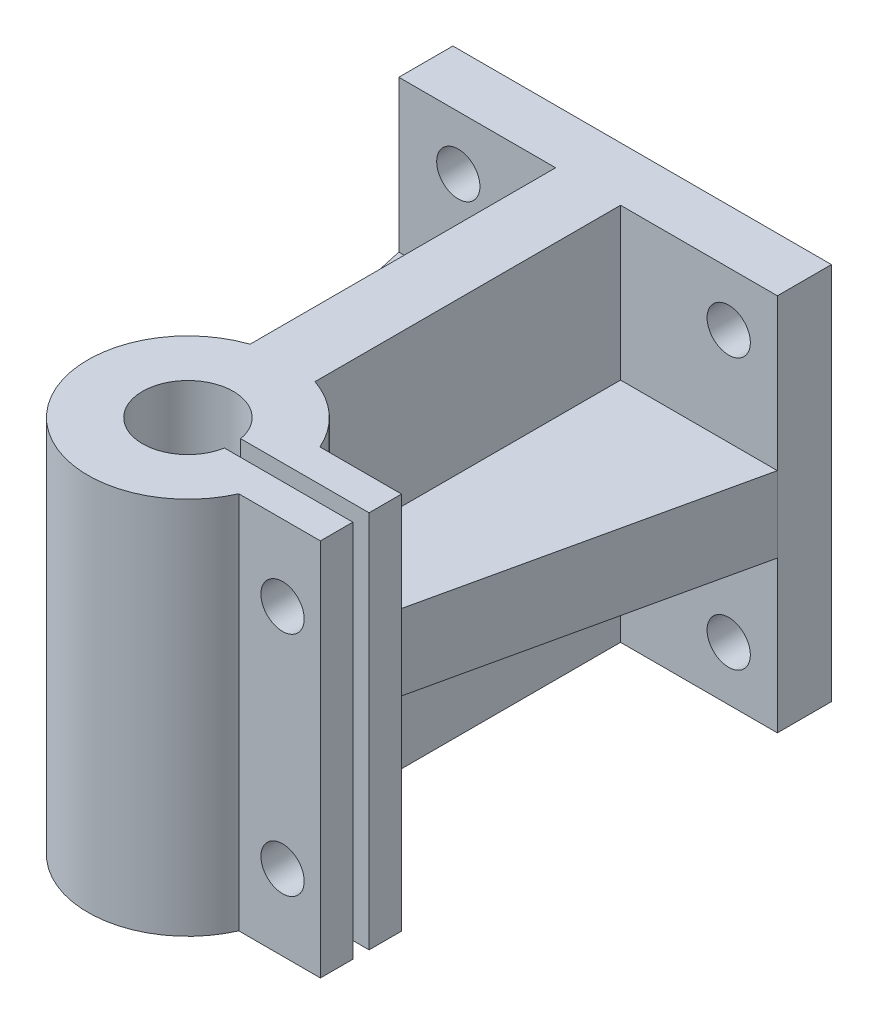
ISO-10303-21;
HEADER;
FILE_DESCRIPTION(('STEP AP214'),'2;1');
FILE_NAME('part.step','',(''),(''),'','','');
FILE_SCHEMA(('AUTOMOTIVE_DESIGN { 1 0 10303 214 1 1 1 1 }'));
ENDSEC;
DATA;
#1=APPLICATION_CONTEXT('core data for automotive mechanical design processes');
#2=APPLICATION_PROTOCOL_DEFINITION('international standard','automotive_design',2000,#1);
#3=PRODUCT_CONTEXT('',#1,'mechanical');
#4=PRODUCT('Part','Part','',(#3));
#5=PRODUCT_RELATED_PRODUCT_CATEGORY('part','',(#4));
#6=PRODUCT_DEFINITION_FORMATION('','',#4);
#7=PRODUCT_DEFINITION_CONTEXT('part definition',#1,'design');
#8=PRODUCT_DEFINITION('design','',#6,#7);
#9=PRODUCT_DEFINITION_SHAPE('','',#8);
#10=(LENGTH_UNIT() NAMED_UNIT(*) SI_UNIT(.MILLI.,.METRE.));
#11=(NAMED_UNIT(*) PLANE_ANGLE_UNIT() SI_UNIT($,.RADIAN.));
#12=(NAMED_UNIT(*) SI_UNIT($,.STERADIAN.) SOLID_ANGLE_UNIT());
#13=UNCERTAINTY_MEASURE_WITH_UNIT(LENGTH_MEASURE(1.E-05),#10,'distance_accuracy_value','');
#14=(GEOMETRIC_REPRESENTATION_CONTEXT(3) GLOBAL_UNCERTAINTY_ASSIGNED_CONTEXT((#13)) GLOBAL_UNIT_ASSIGNED_CONTEXT((#10,
#11,#12)) REPRESENTATION_CONTEXT('',''));
#15=CARTESIAN_POINT('',(0.,0.,0.));
#16=DIRECTION('',(0.,0.,1.));
#17=DIRECTION('',(1.,0.,0.));
#18=AXIS2_PLACEMENT_3D('',#15,#16,#17);
#19=CARTESIAN_POINT('',(0.,35.,37.));
#20=DIRECTION('',(0.,-1.,0.));
#21=DIRECTION('',(0.,0.,-1.));
#22=AXIS2_PLACEMENT_3D('',#19,#20,#21);
#23=CYLINDRICAL_SURFACE('',#22,9.25);
#24=DIRECTION('',(0.,-1.,0.));
#25=VECTOR('',#24,1.);
#26=CARTESIAN_POINT('',(8.45576726264388,35.,40.75));
#27=LINE('',#26,#25);
#28=CARTESIAN_POINT('',(8.45576726264388,35.,40.75));
#29=VERTEX_POINT('',#28);
#30=CARTESIAN_POINT('',(8.45576726264388,0.,40.75));
#31=VERTEX_POINT('',#30);
#32=EDGE_CURVE('E248',#29,#31,#27,.T.);
#33=ORIENTED_EDGE('',*,*,#32,.F.);
#34=CARTESIAN_POINT('',(0.,35.,37.));
#35=DIRECTION('',(0.,-1.,0.));
#36=DIRECTION('',(0.,0.,-1.));
#37=AXIS2_PLACEMENT_3D('',#34,#35,#36);
#38=CIRCLE('',#37,9.25);
#39=CARTESIAN_POINT('',(-3.,35.,28.25));
#40=VERTEX_POINT('',#39);
#41=EDGE_CURVE('E398',#29,#40,#38,.T.);
#42=ORIENTED_EDGE('',*,*,#41,.T.);
#43=DIRECTION('',(0.,-1.,0.));
#44=VECTOR('',#43,1.);
#45=CARTESIAN_POINT('',(-3.,35.,28.25));
#46=LINE('',#45,#44);
#47=CARTESIAN_POINT('',(-3.,21.,28.25));
#48=VERTEX_POINT('',#47);
#49=EDGE_CURVE('E403',#40,#48,#46,.T.);
#50=ORIENTED_EDGE('',*,*,#49,.T.);
#51=CARTESIAN_POINT('',(0.,21.,37.));
#52=DIRECTION('',(0.,1.,0.));
#53=DIRECTION('',(0.,0.,1.));
#54=AXIS2_PLACEMENT_3D('',#51,#52,#53);
#55=CIRCLE('',#54,9.25);
#56=CARTESIAN_POINT('',(-9.25,21.,36.9999999999999));
#57=VERTEX_POINT('',#56);
#58=EDGE_CURVE('E489',#57,#48,#55,.F.);
#59=ORIENTED_EDGE('',*,*,#58,.F.);
#60=DIRECTION('',(0.,-1.,0.));
#61=VECTOR('',#60,1.);
#62=CARTESIAN_POINT('',(-9.25,21.,36.9999999999999));
#63=LINE('',#62,#61);
#64=CARTESIAN_POINT('',(-9.25,14.,36.9999999999999));
#65=VERTEX_POINT('',#64);
#66=EDGE_CURVE('E366',#57,#65,#63,.T.);
#67=ORIENTED_EDGE('',*,*,#66,.T.);
#68=CARTESIAN_POINT('',(0.,14.,37.));
#69=DIRECTION('',(0.,1.,0.));
#70=DIRECTION('',(0.,0.,1.));
#71=AXIS2_PLACEMENT_3D('',#68,#69,#70);
#72=CIRCLE('',#71,9.25);
#73=CARTESIAN_POINT('',(-3.,14.,28.25));
#74=VERTEX_POINT('',#73);
#75=EDGE_CURVE('E485',#65,#74,#72,.F.);
#76=ORIENTED_EDGE('',*,*,#75,.T.);
#77=CARTESIAN_POINT('',(-3.,0.,28.25));
#78=VERTEX_POINT('',#77);
#79=EDGE_CURVE('E397',#74,#78,#46,.T.);
#80=ORIENTED_EDGE('',*,*,#79,.T.);
#81=CARTESIAN_POINT('',(0.,0.,37.));
#82=DIRECTION('',(0.,-1.,0.));
#83=DIRECTION('',(0.,0.,-1.));
#84=AXIS2_PLACEMENT_3D('',#81,#82,#83);
#85=CIRCLE('',#84,9.25);
#86=EDGE_CURVE('E389',#31,#78,#85,.T.);
#87=ORIENTED_EDGE('',*,*,#86,.F.);
#88=EDGE_LOOP('',(#33,#42,#50,#59,#67,#76,#80,#87));
#89=FACE_BOUND('',#88,.T.);
#90=ADVANCED_FACE('F41',(#89),#23,.T.);
#91=DIRECTION('',(0.,-1.,0.));
#92=VECTOR('',#91,1.);
#93=CARTESIAN_POINT('',(8.45576726264388,35.,33.25));
#94=LINE('',#93,#92);
#95=CARTESIAN_POINT('',(8.45576726264388,0.,33.25));
#96=VERTEX_POINT('',#95);
#97=CARTESIAN_POINT('',(8.45576726264388,14.,33.25));
#98=VERTEX_POINT('',#97);
#99=EDGE_CURVE('E65',#96,#98,#94,.F.);
#100=ORIENTED_EDGE('',*,*,#99,.F.);
#101=CARTESIAN_POINT('',(3.,0.,28.25));
#102=VERTEX_POINT('',#101);
#103=EDGE_CURVE('E399',#102,#96,#85,.T.);
#104=ORIENTED_EDGE('',*,*,#103,.F.);
#105=DIRECTION('',(0.,-1.,0.));
#106=VECTOR('',#105,1.);
#107=CARTESIAN_POINT('',(3.,35.,28.25));
#108=LINE('',#107,#106);
#109=CARTESIAN_POINT('',(3.,14.,28.25));
#110=VERTEX_POINT('',#109);
#111=EDGE_CURVE('E481',#102,#110,#108,.F.);
#112=ORIENTED_EDGE('',*,*,#111,.T.);
#113=CARTESIAN_POINT('',(0.,14.,37.));
#114=DIRECTION('',(0.,1.,0.));
#115=DIRECTION('',(0.,0.,1.));
#116=AXIS2_PLACEMENT_3D('',#113,#114,#115);
#117=CIRCLE('',#116,9.25);
#118=EDGE_CURVE('E492',#110,#98,#117,.F.);
#119=ORIENTED_EDGE('',*,*,#118,.T.);
#120=EDGE_LOOP('',(#100,#104,#112,#119));
#121=FACE_BOUND('',#120,.T.);
#122=ADVANCED_FACE('F564',(#121),#23,.T.);
#123=CARTESIAN_POINT('',(-17.5,35.,0.));
#124=DIRECTION('',(0.,0.,-1.));
#125=DIRECTION('',(-1.,0.,0.));
#126=AXIS2_PLACEMENT_3D('',#123,#124,#125);
#127=PLANE('',#126);
#128=CARTESIAN_POINT('',(13.,5.,0.));
#129=DIRECTION('',(0.,0.,-1.));
#130=DIRECTION('',(-1.,0.,0.));
#131=AXIS2_PLACEMENT_3D('',#128,#129,#130);
#132=CIRCLE('',#131,2.);
#133=CARTESIAN_POINT('',(11.,5.,0.));
#134=VERTEX_POINT('',#133);
#135=EDGE_CURVE('E313',#134,#134,#132,.F.);
#136=ORIENTED_EDGE('',*,*,#135,.F.);
#137=EDGE_LOOP('',(#136));
#138=FACE_BOUND('',#137,.T.);
#139=DIRECTION('',(1.,0.,0.));
#140=VECTOR('',#139,1.);
#141=CARTESIAN_POINT('',(17.5,14.,0.));
#142=LINE('',#141,#140);
#143=CARTESIAN_POINT('',(3.,14.,0.));
#144=VERTEX_POINT('',#143);
#145=CARTESIAN_POINT('',(17.5,14.,0.));
#146=VERTEX_POINT('',#145);
#147=EDGE_CURVE('E330',#144,#146,#142,.T.);
#148=ORIENTED_EDGE('',*,*,#147,.F.);
#149=DIRECTION('',(0.,-1.,0.));
#150=VECTOR('',#149,1.);
#151=CARTESIAN_POINT('',(3.,35.,0.));
#152=LINE('',#151,#150);
#153=CARTESIAN_POINT('',(3.,0.,0.));
#154=VERTEX_POINT('',#153);
#155=EDGE_CURVE('E428',#144,#154,#152,.T.);
#156=ORIENTED_EDGE('',*,*,#155,.T.);
#157=DIRECTION('',(1.,0.,0.));
#158=VECTOR('',#157,1.);
#159=CARTESIAN_POINT('',(-17.5,0.,0.));
#160=LINE('',#159,#158);
#161=CARTESIAN_POINT('',(17.5,0.,0.));
#162=VERTEX_POINT('',#161);
#163=EDGE_CURVE('E453',#154,#162,#160,.T.);
#164=ORIENTED_EDGE('',*,*,#163,.T.);
#165=DIRECTION('',(0.,-1.,0.));
#166=VECTOR('',#165,1.);
#167=CARTESIAN_POINT('',(17.5,35.,0.));
#168=LINE('',#167,#166);
#169=EDGE_CURVE('E470',#146,#162,#168,.T.);
#170=ORIENTED_EDGE('',*,*,#169,.F.);
#171=EDGE_LOOP('',(#148,#156,#164,#170));
#172=FACE_BOUND('',#171,.T.);
#173=ADVANCED_FACE('F556',(#138,#172),#127,.F.);
#174=CARTESIAN_POINT('',(3.,35.,0.));
#175=DIRECTION('',(1.,0.,0.));
#176=DIRECTION('',(0.,0.,-1.));
#177=AXIS2_PLACEMENT_3D('',#174,#175,#176);
#178=PLANE('',#177);
#179=ORIENTED_EDGE('',*,*,#155,.F.);
#180=DIRECTION('',(0.,0.,-1.));
#181=VECTOR('',#180,1.);
#182=CARTESIAN_POINT('',(3.,14.,0.));
#183=LINE('',#182,#181);
#184=EDGE_CURVE('E336',#110,#144,#183,.T.);
#185=ORIENTED_EDGE('',*,*,#184,.F.);
#186=ORIENTED_EDGE('',*,*,#111,.F.);
#187=DIRECTION('',(0.,0.,1.));
#188=VECTOR('',#187,1.);
#189=CARTESIAN_POINT('',(3.,0.,0.));
#190=LINE('',#189,#188);
#191=EDGE_CURVE('E412',#154,#102,#190,.T.);
#192=ORIENTED_EDGE('',*,*,#191,.F.);
#193=EDGE_LOOP('',(#179,#185,#186,#192));
#194=FACE_BOUND('',#193,.T.);
#195=ADVANCED_FACE('F562',(#194),#178,.T.);
#196=CARTESIAN_POINT('',(-12.,5.,0.));
#197=DIRECTION('',(0.,0.,-1.));
#198=DIRECTION('',(-1.,0.,0.));
#199=AXIS2_PLACEMENT_3D('',#196,#197,#198);
#200=CIRCLE('',#199,2.);
#201=CARTESIAN_POINT('',(-14.,5.,0.));
#202=VERTEX_POINT('',#201);
#203=EDGE_CURVE('E304',#202,#202,#200,.F.);
#204=ORIENTED_EDGE('',*,*,#203,.F.);
#205=EDGE_LOOP('',(#204));
#206=FACE_BOUND('',#205,.T.);
#207=DIRECTION('',(1.,0.,0.));
#208=VECTOR('',#207,1.);
#209=CARTESIAN_POINT('',(0.,14.,0.));
#210=LINE('',#209,#208);
#211=CARTESIAN_POINT('',(-17.5,14.,0.));
#212=VERTEX_POINT('',#211);
#213=CARTESIAN_POINT('',(-3.,14.,0.));
#214=VERTEX_POINT('',#213);
#215=EDGE_CURVE('E362',#212,#214,#210,.T.);
#216=ORIENTED_EDGE('',*,*,#215,.F.);
#217=DIRECTION('',(0.,-1.,0.));
#218=VECTOR('',#217,1.);
#219=CARTESIAN_POINT('',(-17.5,35.,0.));
#220=LINE('',#219,#218);
#221=CARTESIAN_POINT('',(-17.5,0.,0.));
#222=VERTEX_POINT('',#221);
#223=EDGE_CURVE('E475',#212,#222,#220,.T.);
#224=ORIENTED_EDGE('',*,*,#223,.T.);
#225=CARTESIAN_POINT('',(-3.,0.,0.));
#226=VERTEX_POINT('',#225);
#227=EDGE_CURVE('E454',#222,#226,#160,.T.);
#228=ORIENTED_EDGE('',*,*,#227,.T.);
#229=DIRECTION('',(0.,-1.,0.));
#230=VECTOR('',#229,1.);
#231=CARTESIAN_POINT('',(-3.,35.,0.));
#232=LINE('',#231,#230);
#233=EDGE_CURVE('E416',#214,#226,#232,.T.);
#234=ORIENTED_EDGE('',*,*,#233,.F.);
#235=EDGE_LOOP('',(#216,#224,#228,#234));
#236=FACE_BOUND('',#235,.T.);
#237=ADVANCED_FACE('F535',(#206,#236),#127,.F.);
#238=CARTESIAN_POINT('',(-3.,35.,0.));
#239=DIRECTION('',(-1.,0.,0.));
#240=DIRECTION('',(0.,0.,1.));
#241=AXIS2_PLACEMENT_3D('',#238,#239,#240);
#242=PLANE('',#241);
#243=ORIENTED_EDGE('',*,*,#79,.F.);
#244=DIRECTION('',(0.,0.,-1.));
#245=VECTOR('',#244,1.);
#246=CARTESIAN_POINT('',(-3.,14.,0.));
#247=LINE('',#246,#245);
#248=EDGE_CURVE('E375',#74,#214,#247,.T.);
#249=ORIENTED_EDGE('',*,*,#248,.T.);
#250=ORIENTED_EDGE('',*,*,#233,.T.);
#251=DIRECTION('',(0.,0.,-1.));
#252=VECTOR('',#251,1.);
#253=CARTESIAN_POINT('',(-3.,0.,0.));
#254=LINE('',#253,#252);
#255=EDGE_CURVE('E407',#78,#226,#254,.T.);
#256=ORIENTED_EDGE('',*,*,#255,.F.);
#257=EDGE_LOOP('',(#243,#249,#250,#256));
#258=FACE_BOUND('',#257,.T.);
#259=ADVANCED_FACE('F531',(#258),#242,.T.);
#260=CARTESIAN_POINT('',(-12.,30.,0.));
#261=DIRECTION('',(0.,0.,-1.));
#262=DIRECTION('',(-1.,0.,0.));
#263=AXIS2_PLACEMENT_3D('',#260,#261,#262);
#264=CIRCLE('',#263,2.);
#265=CARTESIAN_POINT('',(-14.,30.,0.));
#266=VERTEX_POINT('',#265);
#267=EDGE_CURVE('E303',#266,#266,#264,.F.);
#268=ORIENTED_EDGE('',*,*,#267,.F.);
#269=EDGE_LOOP('',(#268));
#270=FACE_BOUND('',#269,.T.);
#271=CARTESIAN_POINT('',(-17.5,35.,0.));
#272=VERTEX_POINT('',#271);
#273=CARTESIAN_POINT('',(-17.5,21.,0.));
#274=VERTEX_POINT('',#273);
#275=EDGE_CURVE('E476',#272,#274,#220,.T.);
#276=ORIENTED_EDGE('',*,*,#275,.T.);
#277=DIRECTION('',(1.,0.,0.));
#278=VECTOR('',#277,1.);
#279=CARTESIAN_POINT('',(0.,21.,0.));
#280=LINE('',#279,#278);
#281=CARTESIAN_POINT('',(-3.,21.,0.));
#282=VERTEX_POINT('',#281);
#283=EDGE_CURVE('E361',#274,#282,#280,.T.);
#284=ORIENTED_EDGE('',*,*,#283,.T.);
#285=CARTESIAN_POINT('',(-3.,35.,0.));
#286=VERTEX_POINT('',#285);
#287=EDGE_CURVE('E429',#286,#282,#232,.T.);
#288=ORIENTED_EDGE('',*,*,#287,.F.);
#289=DIRECTION('',(1.,0.,0.));
#290=VECTOR('',#289,1.);
#291=CARTESIAN_POINT('',(-17.5,35.,0.));
#292=LINE('',#291,#290);
#293=EDGE_CURVE('E439',#272,#286,#292,.T.);
#294=ORIENTED_EDGE('',*,*,#293,.F.);
#295=EDGE_LOOP('',(#276,#284,#288,#294));
#296=FACE_BOUND('',#295,.T.);
#297=ADVANCED_FACE('F629',(#270,#296),#127,.F.);
#298=CARTESIAN_POINT('',(-17.5,35.,0.));
#299=DIRECTION('',(1.,0.,0.));
#300=DIRECTION('',(0.,0.,-1.));
#301=AXIS2_PLACEMENT_3D('',#298,#299,#300);
#302=PLANE('',#301);
#303=DIRECTION('',(0.,0.,1.));
#304=VECTOR('',#303,1.);
#305=CARTESIAN_POINT('',(-17.5,0.,0.));
#306=LINE('',#305,#304);
#307=CARTESIAN_POINT('',(-17.5,0.,-5.));
#308=VERTEX_POINT('',#307);
#309=EDGE_CURVE('E427',#308,#222,#306,.T.);
#310=ORIENTED_EDGE('',*,*,#309,.T.);
#311=ORIENTED_EDGE('',*,*,#223,.F.);
#312=DIRECTION('',(0.,-1.,0.));
#313=VECTOR('',#312,1.);
#314=CARTESIAN_POINT('',(-17.5,21.,0.));
#315=LINE('',#314,#313);
#316=EDGE_CURVE('E372',#274,#212,#315,.T.);
#317=ORIENTED_EDGE('',*,*,#316,.F.);
#318=ORIENTED_EDGE('',*,*,#275,.F.);
#319=DIRECTION('',(0.,0.,1.));
#320=VECTOR('',#319,1.);
#321=CARTESIAN_POINT('',(-17.5,35.,0.));
#322=LINE('',#321,#320);
#323=CARTESIAN_POINT('',(-17.5,35.,-5.));
#324=VERTEX_POINT('',#323);
#325=EDGE_CURVE('E433',#324,#272,#322,.T.);
#326=ORIENTED_EDGE('',*,*,#325,.F.);
#327=DIRECTION('',(0.,-1.,0.));
#328=VECTOR('',#327,1.);
#329=CARTESIAN_POINT('',(-17.5,35.,-5.));
#330=LINE('',#329,#328);
#331=EDGE_CURVE('E449',#324,#308,#330,.T.);
#332=ORIENTED_EDGE('',*,*,#331,.T.);
#333=EDGE_LOOP('',(#310,#311,#317,#318,#326,#332));
#334=FACE_BOUND('',#333,.T.);
#335=ADVANCED_FACE('F43',(#334),#302,.F.);
#336=CARTESIAN_POINT('',(13.,30.,0.));
#337=DIRECTION('',(0.,0.,-1.));
#338=DIRECTION('',(-1.,0.,0.));
#339=AXIS2_PLACEMENT_3D('',#336,#337,#338);
#340=CIRCLE('',#339,2.);
#341=CARTESIAN_POINT('',(11.,30.,0.));
#342=VERTEX_POINT('',#341);
#343=EDGE_CURVE('E326',#342,#342,#340,.F.);
#344=ORIENTED_EDGE('',*,*,#343,.F.);
#345=EDGE_LOOP('',(#344));
#346=FACE_BOUND('',#345,.T.);
#347=CARTESIAN_POINT('',(3.,35.,0.));
#348=VERTEX_POINT('',#347);
#349=CARTESIAN_POINT('',(3.,21.,0.));
#350=VERTEX_POINT('',#349);
#351=EDGE_CURVE('E423',#348,#350,#152,.T.);
#352=ORIENTED_EDGE('',*,*,#351,.T.);
#353=DIRECTION('',(1.,0.,0.));
#354=VECTOR('',#353,1.);
#355=CARTESIAN_POINT('',(17.5,21.,0.));
#356=LINE('',#355,#354);
#357=CARTESIAN_POINT('',(17.5,21.,0.));
#358=VERTEX_POINT('',#357);
#359=EDGE_CURVE('E331',#350,#358,#356,.T.);
#360=ORIENTED_EDGE('',*,*,#359,.T.);
#361=CARTESIAN_POINT('',(17.5,35.,0.));
#362=VERTEX_POINT('',#361);
#363=EDGE_CURVE('E471',#362,#358,#168,.T.);
#364=ORIENTED_EDGE('',*,*,#363,.F.);
#365=EDGE_CURVE('E437',#348,#362,#292,.T.);
#366=ORIENTED_EDGE('',*,*,#365,.F.);
#367=EDGE_LOOP('',(#352,#360,#364,#366));
#368=FACE_BOUND('',#367,.T.);
#369=ADVANCED_FACE('F573',(#346,#368),#127,.F.);
#370=CARTESIAN_POINT('',(17.5,35.,0.));
#371=DIRECTION('',(-1.,0.,0.));
#372=DIRECTION('',(0.,0.,1.));
#373=AXIS2_PLACEMENT_3D('',#370,#371,#372);
#374=PLANE('',#373);
#375=DIRECTION('',(0.,0.,-1.));
#376=VECTOR('',#375,1.);
#377=CARTESIAN_POINT('',(17.5,0.,0.));
#378=LINE('',#377,#376);
#379=CARTESIAN_POINT('',(17.5,0.,-5.));
#380=VERTEX_POINT('',#379);
#381=EDGE_CURVE('E458',#162,#380,#378,.T.);
#382=ORIENTED_EDGE('',*,*,#381,.T.);
#383=DIRECTION('',(0.,-1.,0.));
#384=VECTOR('',#383,1.);
#385=CARTESIAN_POINT('',(17.5,35.,-5.));
#386=LINE('',#385,#384);
#387=CARTESIAN_POINT('',(17.5,35.,-5.));
#388=VERTEX_POINT('',#387);
#389=EDGE_CURVE('E466',#388,#380,#386,.T.);
#390=ORIENTED_EDGE('',*,*,#389,.F.);
#391=DIRECTION('',(0.,0.,-1.));
#392=VECTOR('',#391,1.);
#393=CARTESIAN_POINT('',(17.5,35.,0.));
#394=LINE('',#393,#392);
#395=EDGE_CURVE('E443',#362,#388,#394,.T.);
#396=ORIENTED_EDGE('',*,*,#395,.F.);
#397=ORIENTED_EDGE('',*,*,#363,.T.);
#398=DIRECTION('',(0.,-1.,0.));
#399=VECTOR('',#398,1.);
#400=CARTESIAN_POINT('',(17.5,21.,0.));
#401=LINE('',#400,#399);
#402=EDGE_CURVE('E344',#358,#146,#401,.T.);
#403=ORIENTED_EDGE('',*,*,#402,.T.);
#404=ORIENTED_EDGE('',*,*,#169,.T.);
#405=EDGE_LOOP('',(#382,#390,#396,#397,#403,#404));
#406=FACE_BOUND('',#405,.T.);
#407=ADVANCED_FACE('F551',(#406),#374,.F.);
#408=CARTESIAN_POINT('',(-17.5,35.,-5.));
#409=DIRECTION('',(0.,0.,1.));
#410=DIRECTION('',(1.,0.,0.));
#411=AXIS2_PLACEMENT_3D('',#408,#409,#410);
#412=PLANE('',#411);
#413=CARTESIAN_POINT('',(13.,5.,-5.));
#414=DIRECTION('',(0.,0.,-1.));
#415=DIRECTION('',(-1.,0.,0.));
#416=AXIS2_PLACEMENT_3D('',#413,#414,#415);
#417=CIRCLE('',#416,2.);
#418=CARTESIAN_POINT('',(11.,5.,-5.));
#419=VERTEX_POINT('',#418);
#420=EDGE_CURVE('E298',#419,#419,#417,.T.);
#421=ORIENTED_EDGE('',*,*,#420,.F.);
#422=EDGE_LOOP('',(#421));
#423=FACE_BOUND('',#422,.T.);
#424=CARTESIAN_POINT('',(-12.,5.,-5.));
#425=DIRECTION('',(0.,0.,-1.));
#426=DIRECTION('',(-1.,0.,0.));
#427=AXIS2_PLACEMENT_3D('',#424,#425,#426);
#428=CIRCLE('',#427,2.);
#429=CARTESIAN_POINT('',(-14.,5.,-5.));
#430=VERTEX_POINT('',#429);
#431=EDGE_CURVE('E309',#430,#430,#428,.T.);
#432=ORIENTED_EDGE('',*,*,#431,.F.);
#433=EDGE_LOOP('',(#432));
#434=FACE_BOUND('',#433,.T.);
#435=CARTESIAN_POINT('',(-12.,30.,-5.));
#436=DIRECTION('',(0.,0.,-1.));
#437=DIRECTION('',(-1.,0.,0.));
#438=AXIS2_PLACEMENT_3D('',#435,#436,#437);
#439=CIRCLE('',#438,2.);
#440=CARTESIAN_POINT('',(-14.,30.,-5.));
#441=VERTEX_POINT('',#440);
#442=EDGE_CURVE('E299',#441,#441,#439,.T.);
#443=ORIENTED_EDGE('',*,*,#442,.F.);
#444=EDGE_LOOP('',(#443));
#445=FACE_BOUND('',#444,.T.);
#446=CARTESIAN_POINT('',(13.,30.,-5.));
#447=DIRECTION('',(0.,0.,-1.));
#448=DIRECTION('',(-1.,0.,0.));
#449=AXIS2_PLACEMENT_3D('',#446,#447,#448);
#450=CIRCLE('',#449,2.);
#451=CARTESIAN_POINT('',(11.,30.,-5.));
#452=VERTEX_POINT('',#451);
#453=EDGE_CURVE('E308',#452,#452,#450,.T.);
#454=ORIENTED_EDGE('',*,*,#453,.F.);
#455=EDGE_LOOP('',(#454));
#456=FACE_BOUND('',#455,.T.);
#457=DIRECTION('',(-1.,0.,0.));
#458=VECTOR('',#457,1.);
#459=CARTESIAN_POINT('',(-17.5,0.,-5.));
#460=LINE('',#459,#458);
#461=EDGE_CURVE('E438',#380,#308,#460,.T.);
#462=ORIENTED_EDGE('',*,*,#461,.T.);
#463=ORIENTED_EDGE('',*,*,#331,.F.);
#464=DIRECTION('',(-1.,0.,0.));
#465=VECTOR('',#464,1.);
#466=CARTESIAN_POINT('',(-17.5,35.,-5.));
#467=LINE('',#466,#465);
#468=EDGE_CURVE('E446',#388,#324,#467,.T.);
#469=ORIENTED_EDGE('',*,*,#468,.F.);
#470=ORIENTED_EDGE('',*,*,#389,.T.);
#471=EDGE_LOOP('',(#462,#463,#469,#470));
#472=FACE_BOUND('',#471,.T.);
#473=ADVANCED_FACE('F546',(#423,#434,#445,#456,#472),#412,.F.);
#474=CARTESIAN_POINT('',(0.,35.,0.));
#475=DIRECTION('',(0.,-1.,0.));
#476=DIRECTION('',(0.,0.,-1.));
#477=AXIS2_PLACEMENT_3D('',#474,#475,#476);
#478=PLANE('',#477);
#479=DIRECTION('',(0.,0.,1.));
#480=VECTOR('',#479,1.);
#481=CARTESIAN_POINT('',(16.,35.,37.7500008166615));
#482=LINE('',#481,#480);
#483=CARTESIAN_POINT('',(16.,35.,37.7500008166615));
#484=VERTEX_POINT('',#483);
#485=CARTESIAN_POINT('',(16.,35.,40.75));
#486=VERTEX_POINT('',#485);
#487=EDGE_CURVE('E226',#484,#486,#482,.T.);
#488=ORIENTED_EDGE('',*,*,#487,.F.);
#489=DIRECTION('',(1.,0.,0.));
#490=VECTOR('',#489,1.);
#491=CARTESIAN_POINT('',(4.13249304597202,35.,37.7500008166615));
#492=LINE('',#491,#490);
#493=CARTESIAN_POINT('',(4.13249304597202,35.,37.7500008166615));
#494=VERTEX_POINT('',#493);
#495=EDGE_CURVE('E209',#494,#484,#492,.T.);
#496=ORIENTED_EDGE('',*,*,#495,.F.);
#497=CARTESIAN_POINT('',(0.,35.,37.));
#498=DIRECTION('',(0.,-1.,0.));
#499=DIRECTION('',(0.,0.,-1.));
#500=AXIS2_PLACEMENT_3D('',#497,#498,#499);
#501=CIRCLE('',#500,4.2);
#502=CARTESIAN_POINT('',(4.13249304597202,35.,36.25));
#503=VERTEX_POINT('',#502);
#504=EDGE_CURVE('E386',#494,#503,#501,.T.);
#505=ORIENTED_EDGE('',*,*,#504,.T.);
#506=DIRECTION('',(-1.,0.,0.));
#507=VECTOR('',#506,1.);
#508=CARTESIAN_POINT('',(4.13249304597202,35.,36.25));
#509=LINE('',#508,#507);
#510=CARTESIAN_POINT('',(16.,35.,36.25));
#511=VERTEX_POINT('',#510);
#512=EDGE_CURVE('E295',#511,#503,#509,.T.);
#513=ORIENTED_EDGE('',*,*,#512,.F.);
#514=DIRECTION('',(0.,0.,1.));
#515=VECTOR('',#514,1.);
#516=CARTESIAN_POINT('',(16.,35.,36.25));
#517=LINE('',#516,#515);
#518=CARTESIAN_POINT('',(16.,35.,33.25));
#519=VERTEX_POINT('',#518);
#520=EDGE_CURVE('E256',#519,#511,#517,.T.);
#521=ORIENTED_EDGE('',*,*,#520,.F.);
#522=DIRECTION('',(1.,0.,0.));
#523=VECTOR('',#522,1.);
#524=CARTESIAN_POINT('',(6.32751434892675,35.,33.25));
#525=LINE('',#524,#523);
#526=CARTESIAN_POINT('',(8.45576726264388,35.,33.25));
#527=VERTEX_POINT('',#526);
#528=EDGE_CURVE('E253',#527,#519,#525,.T.);
#529=ORIENTED_EDGE('',*,*,#528,.F.);
#530=CARTESIAN_POINT('',(3.,35.,28.25));
#531=VERTEX_POINT('',#530);
#532=EDGE_CURVE('E393',#531,#527,#38,.T.);
#533=ORIENTED_EDGE('',*,*,#532,.F.);
#534=DIRECTION('',(0.,0.,1.));
#535=VECTOR('',#534,1.);
#536=CARTESIAN_POINT('',(3.,35.,0.));
#537=LINE('',#536,#535);
#538=EDGE_CURVE('E411',#348,#531,#537,.T.);
#539=ORIENTED_EDGE('',*,*,#538,.F.);
#540=ORIENTED_EDGE('',*,*,#365,.T.);
#541=ORIENTED_EDGE('',*,*,#395,.T.);
#542=ORIENTED_EDGE('',*,*,#468,.T.);
#543=ORIENTED_EDGE('',*,*,#325,.T.);
#544=ORIENTED_EDGE('',*,*,#293,.T.);
#545=DIRECTION('',(0.,0.,-1.));
#546=VECTOR('',#545,1.);
#547=CARTESIAN_POINT('',(-3.,35.,0.));
#548=LINE('',#547,#546);
#549=EDGE_CURVE('E408',#40,#286,#548,.T.);
#550=ORIENTED_EDGE('',*,*,#549,.F.);
#551=ORIENTED_EDGE('',*,*,#41,.F.);
#552=DIRECTION('',(-1.,0.,0.));
#553=VECTOR('',#552,1.);
#554=CARTESIAN_POINT('',(6.32751434892675,35.,40.75));
#555=LINE('',#554,#553);
#556=EDGE_CURVE('E231',#486,#29,#555,.T.);
#557=ORIENTED_EDGE('',*,*,#556,.F.);
#558=EDGE_LOOP('',(#488,#496,#505,#513,#521,#529,#533,#539,#540,#541,#542,#543,#544,#550,#551,#557));
#559=FACE_BOUND('',#558,.T.);
#560=ADVANCED_FACE('F233',(#559),#478,.F.);
#561=CARTESIAN_POINT('',(0.,0.,0.));
#562=DIRECTION('',(0.,-1.,0.));
#563=DIRECTION('',(0.,0.,-1.));
#564=AXIS2_PLACEMENT_3D('',#561,#562,#563);
#565=PLANE('',#564);
#566=CARTESIAN_POINT('',(0.,0.,37.));
#567=DIRECTION('',(0.,-1.,0.));
#568=DIRECTION('',(0.,0.,-1.));
#569=AXIS2_PLACEMENT_3D('',#566,#567,#568);
#570=CIRCLE('',#569,4.2);
#571=CARTESIAN_POINT('',(4.13249304597202,0.,37.7500008166615));
#572=VERTEX_POINT('',#571);
#573=CARTESIAN_POINT('',(4.13249304597202,0.,36.25));
#574=VERTEX_POINT('',#573);
#575=EDGE_CURVE('E385',#572,#574,#570,.T.);
#576=ORIENTED_EDGE('',*,*,#575,.F.);
#577=DIRECTION('',(-1.,0.,0.));
#578=VECTOR('',#577,1.);
#579=CARTESIAN_POINT('',(4.13249304597202,0.,37.7500008166615));
#580=LINE('',#579,#578);
#581=CARTESIAN_POINT('',(16.,0.,37.7500008166615));
#582=VERTEX_POINT('',#581);
#583=EDGE_CURVE('E292',#582,#572,#580,.T.);
#584=ORIENTED_EDGE('',*,*,#583,.F.);
#585=DIRECTION('',(0.,0.,1.));
#586=VECTOR('',#585,1.);
#587=CARTESIAN_POINT('',(16.,0.,37.7500008166615));
#588=LINE('',#587,#586);
#589=CARTESIAN_POINT('',(16.,0.,40.75));
#590=VERTEX_POINT('',#589);
#591=EDGE_CURVE('E228',#582,#590,#588,.T.);
#592=ORIENTED_EDGE('',*,*,#591,.T.);
#593=DIRECTION('',(-1.,0.,0.));
#594=VECTOR('',#593,1.);
#595=CARTESIAN_POINT('',(6.32751434892675,0.,40.75));
#596=LINE('',#595,#594);
#597=EDGE_CURVE('E57',#590,#31,#596,.T.);
#598=ORIENTED_EDGE('',*,*,#597,.T.);
#599=ORIENTED_EDGE('',*,*,#86,.T.);
#600=ORIENTED_EDGE('',*,*,#255,.T.);
#601=ORIENTED_EDGE('',*,*,#227,.F.);
#602=ORIENTED_EDGE('',*,*,#309,.F.);
#603=ORIENTED_EDGE('',*,*,#461,.F.);
#604=ORIENTED_EDGE('',*,*,#381,.F.);
#605=ORIENTED_EDGE('',*,*,#163,.F.);
#606=ORIENTED_EDGE('',*,*,#191,.T.);
#607=ORIENTED_EDGE('',*,*,#103,.T.);
#608=DIRECTION('',(1.,0.,0.));
#609=VECTOR('',#608,1.);
#610=CARTESIAN_POINT('',(6.32751434892675,0.,33.25));
#611=LINE('',#610,#609);
#612=CARTESIAN_POINT('',(16.,0.,33.25));
#613=VERTEX_POINT('',#612);
#614=EDGE_CURVE('E252',#96,#613,#611,.T.);
#615=ORIENTED_EDGE('',*,*,#614,.T.);
#616=DIRECTION('',(0.,0.,1.));
#617=VECTOR('',#616,1.);
#618=CARTESIAN_POINT('',(16.,0.,36.25));
#619=LINE('',#618,#617);
#620=CARTESIAN_POINT('',(16.,0.,36.25));
#621=VERTEX_POINT('',#620);
#622=EDGE_CURVE('E257',#613,#621,#619,.T.);
#623=ORIENTED_EDGE('',*,*,#622,.T.);
#624=DIRECTION('',(1.,0.,0.));
#625=VECTOR('',#624,1.);
#626=CARTESIAN_POINT('',(4.13249304597202,0.,36.25));
#627=LINE('',#626,#625);
#628=EDGE_CURVE('E221',#574,#621,#627,.T.);
#629=ORIENTED_EDGE('',*,*,#628,.F.);
#630=EDGE_LOOP('',(#576,#584,#592,#598,#599,#600,#601,#602,#603,#604,#605,#606,#607,#615,#623,#629));
#631=FACE_BOUND('',#630,.T.);
#632=ADVANCED_FACE('F524',(#631),#565,.T.);
#633=DIRECTION('',(0.,0.,-1.));
#634=VECTOR('',#633,1.);
#635=CARTESIAN_POINT('',(-3.,21.,0.));
#636=LINE('',#635,#634);
#637=EDGE_CURVE('E382',#48,#282,#636,.T.);
#638=ORIENTED_EDGE('',*,*,#637,.F.);
#639=ORIENTED_EDGE('',*,*,#49,.F.);
#640=ORIENTED_EDGE('',*,*,#549,.T.);
#641=ORIENTED_EDGE('',*,*,#287,.T.);
#642=EDGE_LOOP('',(#638,#639,#640,#641));
#643=FACE_BOUND('',#642,.T.);
#644=ADVANCED_FACE('F617',(#643),#242,.T.);
#645=DIRECTION('',(0.,0.,-1.));
#646=VECTOR('',#645,1.);
#647=CARTESIAN_POINT('',(3.,21.,0.));
#648=LINE('',#647,#646);
#649=CARTESIAN_POINT('',(3.,21.,28.25));
#650=VERTEX_POINT('',#649);
#651=EDGE_CURVE('E340',#650,#350,#648,.T.);
#652=ORIENTED_EDGE('',*,*,#651,.T.);
#653=ORIENTED_EDGE('',*,*,#351,.F.);
#654=ORIENTED_EDGE('',*,*,#538,.T.);
#655=EDGE_CURVE('E480',#650,#531,#108,.F.);
#656=ORIENTED_EDGE('',*,*,#655,.F.);
#657=EDGE_LOOP('',(#652,#653,#654,#656));
#658=FACE_BOUND('',#657,.T.);
#659=ADVANCED_FACE('F508',(#658),#178,.T.);
#660=DIRECTION('',(0.,-1.,0.));
#661=VECTOR('',#660,1.);
#662=CARTESIAN_POINT('',(8.45576726264388,35.,33.25));
#663=LINE('',#662,#661);
#664=CARTESIAN_POINT('',(8.45576726264388,21.,33.25));
#665=VERTEX_POINT('',#664);
#666=EDGE_CURVE('E282',#665,#527,#663,.F.);
#667=ORIENTED_EDGE('',*,*,#666,.F.);
#668=CARTESIAN_POINT('',(0.,21.,37.));
#669=DIRECTION('',(0.,1.,0.));
#670=DIRECTION('',(0.,0.,1.));
#671=AXIS2_PLACEMENT_3D('',#668,#669,#670);
#672=CIRCLE('',#671,9.25);
#673=EDGE_CURVE('E50',#650,#665,#672,.F.);
#674=ORIENTED_EDGE('',*,*,#673,.F.);
#675=ORIENTED_EDGE('',*,*,#655,.T.);
#676=ORIENTED_EDGE('',*,*,#532,.T.);
#677=EDGE_LOOP('',(#667,#674,#675,#676));
#678=FACE_BOUND('',#677,.T.);
#679=ADVANCED_FACE('F505',(#678),#23,.T.);
#680=CARTESIAN_POINT('',(0.,35.,37.));
#681=DIRECTION('',(0.,-1.,0.));
#682=DIRECTION('',(0.,0.,-1.));
#683=AXIS2_PLACEMENT_3D('',#680,#681,#682);
#684=CYLINDRICAL_SURFACE('',#683,4.2);
#685=ORIENTED_EDGE('',*,*,#504,.F.);
#686=DIRECTION('',(0.,-1.,0.));
#687=VECTOR('',#686,1.);
#688=CARTESIAN_POINT('',(4.13249304597202,35.,37.7500008166615));
#689=LINE('',#688,#687);
#690=EDGE_CURVE('E215',#572,#494,#689,.F.);
#691=ORIENTED_EDGE('',*,*,#690,.F.);
#692=ORIENTED_EDGE('',*,*,#575,.T.);
#693=DIRECTION('',(0.,-1.,0.));
#694=VECTOR('',#693,1.);
#695=CARTESIAN_POINT('',(4.13249319418678,35.,36.25));
#696=LINE('',#695,#694);
#697=EDGE_CURVE('E285',#503,#574,#696,.T.);
#698=ORIENTED_EDGE('',*,*,#697,.F.);
#699=EDGE_LOOP('',(#685,#691,#692,#698));
#700=FACE_BOUND('',#699,.T.);
#701=ADVANCED_FACE('F586',(#700),#684,.F.);
#702=CARTESIAN_POINT('',(-17.5,21.,0.));
#703=DIRECTION('',(-0.9760316384821,0.,0.217628676148036));
#704=DIRECTION('',(0.217628676148036,0.,0.9760316384821));
#705=AXIS2_PLACEMENT_3D('',#702,#703,#704);
#706=PLANE('',#705);
#707=DIRECTION('',(-0.217628676148036,0.,-0.9760316384821));
#708=VECTOR('',#707,1.);
#709=CARTESIAN_POINT('',(-17.5,14.,0.));
#710=LINE('',#709,#708);
#711=EDGE_CURVE('E357',#65,#212,#710,.T.);
#712=ORIENTED_EDGE('',*,*,#711,.F.);
#713=ORIENTED_EDGE('',*,*,#66,.F.);
#714=DIRECTION('',(-0.217628676148036,0.,-0.9760316384821));
#715=VECTOR('',#714,1.);
#716=CARTESIAN_POINT('',(-17.5,21.,0.));
#717=LINE('',#716,#715);
#718=EDGE_CURVE('E358',#57,#274,#717,.T.);
#719=ORIENTED_EDGE('',*,*,#718,.T.);
#720=ORIENTED_EDGE('',*,*,#316,.T.);
#721=EDGE_LOOP('',(#712,#713,#719,#720));
#722=FACE_BOUND('',#721,.T.);
#723=ADVANCED_FACE('F616',(#722),#706,.T.);
#724=CARTESIAN_POINT('',(0.,21.,0.));
#725=DIRECTION('',(0.,1.,0.));
#726=DIRECTION('',(0.,0.,1.));
#727=AXIS2_PLACEMENT_3D('',#724,#725,#726);
#728=PLANE('',#727);
#729=ORIENTED_EDGE('',*,*,#58,.T.);
#730=ORIENTED_EDGE('',*,*,#637,.T.);
#731=ORIENTED_EDGE('',*,*,#283,.F.);
#732=ORIENTED_EDGE('',*,*,#718,.F.);
#733=EDGE_LOOP('',(#729,#730,#731,#732));
#734=FACE_BOUND('',#733,.T.);
#735=ADVANCED_FACE('F657',(#734),#728,.T.);
#736=CARTESIAN_POINT('',(0.,14.,0.));
#737=DIRECTION('',(0.,1.,0.));
#738=DIRECTION('',(0.,0.,1.));
#739=AXIS2_PLACEMENT_3D('',#736,#737,#738);
#740=PLANE('',#739);
#741=ORIENTED_EDGE('',*,*,#248,.F.);
#742=ORIENTED_EDGE('',*,*,#75,.F.);
#743=ORIENTED_EDGE('',*,*,#711,.T.);
#744=ORIENTED_EDGE('',*,*,#215,.T.);
#745=EDGE_LOOP('',(#741,#742,#743,#744));
#746=FACE_BOUND('',#745,.T.);
#747=ADVANCED_FACE('F655',(#746),#740,.F.);
#748=CARTESIAN_POINT('',(9.25,21.,37.));
#749=DIRECTION('',(0.9760316384821,0.,0.217628676148036));
#750=DIRECTION('',(0.217628676148036,0.,-0.9760316384821));
#751=AXIS2_PLACEMENT_3D('',#748,#749,#750);
#752=PLANE('',#751);
#753=DIRECTION('',(0.,1.,0.));
#754=VECTOR('',#753,1.);
#755=CARTESIAN_POINT('',(10.0861486486486,21.,33.25));
#756=LINE('',#755,#754);
#757=CARTESIAN_POINT('',(10.0861486486486,14.,33.25));
#758=VERTEX_POINT('',#757);
#759=CARTESIAN_POINT('',(10.0861486486486,21.,33.25));
#760=VERTEX_POINT('',#759);
#761=EDGE_CURVE('E271',#758,#760,#756,.T.);
#762=ORIENTED_EDGE('',*,*,#761,.F.);
#763=DIRECTION('',(-0.217628676148036,0.,0.9760316384821));
#764=VECTOR('',#763,1.);
#765=CARTESIAN_POINT('',(9.25,14.,37.));
#766=LINE('',#765,#764);
#767=EDGE_CURVE('E348',#146,#758,#766,.T.);
#768=ORIENTED_EDGE('',*,*,#767,.F.);
#769=ORIENTED_EDGE('',*,*,#402,.F.);
#770=DIRECTION('',(-0.217628676148036,0.,0.9760316384821));
#771=VECTOR('',#770,1.);
#772=CARTESIAN_POINT('',(9.25,21.,37.));
#773=LINE('',#772,#771);
#774=EDGE_CURVE('E335',#358,#760,#773,.T.);
#775=ORIENTED_EDGE('',*,*,#774,.T.);
#776=EDGE_LOOP('',(#762,#768,#769,#775));
#777=FACE_BOUND('',#776,.T.);
#778=ADVANCED_FACE('F570',(#777),#752,.T.);
#779=CARTESIAN_POINT('',(0.,21.,0.));
#780=DIRECTION('',(0.,1.,0.));
#781=DIRECTION('',(0.,0.,1.));
#782=AXIS2_PLACEMENT_3D('',#779,#780,#781);
#783=PLANE('',#782);
#784=DIRECTION('',(-1.,0.,0.));
#785=VECTOR('',#784,1.);
#786=CARTESIAN_POINT('',(0.,21.,33.25));
#787=LINE('',#786,#785);
#788=EDGE_CURVE('E279',#760,#665,#787,.T.);
#789=ORIENTED_EDGE('',*,*,#788,.F.);
#790=ORIENTED_EDGE('',*,*,#774,.F.);
#791=ORIENTED_EDGE('',*,*,#359,.F.);
#792=ORIENTED_EDGE('',*,*,#651,.F.);
#793=ORIENTED_EDGE('',*,*,#673,.T.);
#794=EDGE_LOOP('',(#789,#790,#791,#792,#793));
#795=FACE_BOUND('',#794,.T.);
#796=ADVANCED_FACE('F500',(#795),#783,.T.);
#797=CARTESIAN_POINT('',(0.,14.,0.));
#798=DIRECTION('',(0.,1.,0.));
#799=DIRECTION('',(0.,0.,1.));
#800=AXIS2_PLACEMENT_3D('',#797,#798,#799);
#801=PLANE('',#800);
#802=ORIENTED_EDGE('',*,*,#767,.T.);
#803=DIRECTION('',(-1.,0.,0.));
#804=VECTOR('',#803,1.);
#805=CARTESIAN_POINT('',(0.,14.,33.25));
#806=LINE('',#805,#804);
#807=EDGE_CURVE('E11',#758,#98,#806,.T.);
#808=ORIENTED_EDGE('',*,*,#807,.T.);
#809=ORIENTED_EDGE('',*,*,#118,.F.);
#810=ORIENTED_EDGE('',*,*,#184,.T.);
#811=ORIENTED_EDGE('',*,*,#147,.T.);
#812=EDGE_LOOP('',(#802,#808,#809,#810,#811));
#813=FACE_BOUND('',#812,.T.);
#814=ADVANCED_FACE('F566',(#813),#801,.F.);
#815=CARTESIAN_POINT('',(13.,30.,46.251));
#816=DIRECTION('',(0.,0.,-1.));
#817=DIRECTION('',(-1.,0.,0.));
#818=AXIS2_PLACEMENT_3D('',#815,#816,#817);
#819=CYLINDRICAL_SURFACE('',#818,2.);
#820=ORIENTED_EDGE('',*,*,#453,.T.);
#821=EDGE_LOOP('',(#820));
#822=FACE_BOUND('',#821,.T.);
#823=ORIENTED_EDGE('',*,*,#343,.T.);
#824=EDGE_LOOP('',(#823));
#825=FACE_BOUND('',#824,.T.);
#826=ADVANCED_FACE('F721',(#822,#825),#819,.F.);
#827=CARTESIAN_POINT('',(-12.,30.,46.251));
#828=DIRECTION('',(0.,0.,-1.));
#829=DIRECTION('',(-1.,0.,0.));
#830=AXIS2_PLACEMENT_3D('',#827,#828,#829);
#831=CYLINDRICAL_SURFACE('',#830,2.);
#832=ORIENTED_EDGE('',*,*,#442,.T.);
#833=EDGE_LOOP('',(#832));
#834=FACE_BOUND('',#833,.T.);
#835=ORIENTED_EDGE('',*,*,#267,.T.);
#836=EDGE_LOOP('',(#835));
#837=FACE_BOUND('',#836,.T.);
#838=ADVANCED_FACE('F726',(#834,#837),#831,.F.);
#839=CARTESIAN_POINT('',(-12.,5.,46.251));
#840=DIRECTION('',(0.,0.,-1.));
#841=DIRECTION('',(-1.,0.,0.));
#842=AXIS2_PLACEMENT_3D('',#839,#840,#841);
#843=CYLINDRICAL_SURFACE('',#842,2.);
#844=ORIENTED_EDGE('',*,*,#431,.T.);
#845=EDGE_LOOP('',(#844));
#846=FACE_BOUND('',#845,.T.);
#847=ORIENTED_EDGE('',*,*,#203,.T.);
#848=EDGE_LOOP('',(#847));
#849=FACE_BOUND('',#848,.T.);
#850=ADVANCED_FACE('F598',(#846,#849),#843,.F.);
#851=CARTESIAN_POINT('',(13.,5.,46.251));
#852=DIRECTION('',(0.,0.,-1.));
#853=DIRECTION('',(-1.,0.,0.));
#854=AXIS2_PLACEMENT_3D('',#851,#852,#853);
#855=CYLINDRICAL_SURFACE('',#854,2.);
#856=ORIENTED_EDGE('',*,*,#420,.T.);
#857=EDGE_LOOP('',(#856));
#858=FACE_BOUND('',#857,.T.);
#859=ORIENTED_EDGE('',*,*,#135,.T.);
#860=EDGE_LOOP('',(#859));
#861=FACE_BOUND('',#860,.T.);
#862=ADVANCED_FACE('F589',(#858,#861),#855,.F.);
#863=CARTESIAN_POINT('',(4.13249304597202,35.001,36.25));
#864=DIRECTION('',(0.,0.,-1.));
#865=DIRECTION('',(-1.,0.,0.));
#866=AXIS2_PLACEMENT_3D('',#863,#864,#865);
#867=PLANE('',#866);
#868=CARTESIAN_POINT('',(12.5,28.,36.25));
#869=DIRECTION('',(0.,0.,-1.));
#870=DIRECTION('',(-1.,0.,0.));
#871=AXIS2_PLACEMENT_3D('',#868,#869,#870);
#872=CIRCLE('',#871,2.);
#873=CARTESIAN_POINT('',(10.5,28.,36.25));
#874=VERTEX_POINT('',#873);
#875=EDGE_CURVE('E242',#874,#874,#872,.T.);
#876=ORIENTED_EDGE('',*,*,#875,.T.);
#877=EDGE_LOOP('',(#876));
#878=FACE_BOUND('',#877,.T.);
#879=CARTESIAN_POINT('',(12.5,7.,36.25));
#880=DIRECTION('',(0.,0.,-1.));
#881=DIRECTION('',(-1.,0.,0.));
#882=AXIS2_PLACEMENT_3D('',#879,#880,#881);
#883=CIRCLE('',#882,2.);
#884=CARTESIAN_POINT('',(10.5,7.,36.25));
#885=VERTEX_POINT('',#884);
#886=EDGE_CURVE('E906',#885,#885,#883,.T.);
#887=ORIENTED_EDGE('',*,*,#886,.T.);
#888=EDGE_LOOP('',(#887));
#889=FACE_BOUND('',#888,.T.);
#890=ORIENTED_EDGE('',*,*,#628,.T.);
#891=DIRECTION('',(0.,-1.,0.));
#892=VECTOR('',#891,1.);
#893=CARTESIAN_POINT('',(16.,35.,36.25));
#894=LINE('',#893,#892);
#895=EDGE_CURVE('E267',#511,#621,#894,.T.);
#896=ORIENTED_EDGE('',*,*,#895,.F.);
#897=ORIENTED_EDGE('',*,*,#512,.T.);
#898=ORIENTED_EDGE('',*,*,#697,.T.);
#899=EDGE_LOOP('',(#890,#896,#897,#898));
#900=FACE_BOUND('',#899,.T.);
#901=ADVANCED_FACE('F587',(#878,#889,#900),#867,.F.);
#902=CARTESIAN_POINT('',(4.13249304597202,35.001,37.7500008166615));
#903=DIRECTION('',(0.,0.,1.));
#904=DIRECTION('',(1.,0.,0.));
#905=AXIS2_PLACEMENT_3D('',#902,#903,#904);
#906=PLANE('',#905);
#907=CARTESIAN_POINT('',(12.5,28.,37.7500008166615));
#908=DIRECTION('',(0.,0.,1.));
#909=DIRECTION('',(1.,0.,0.));
#910=AXIS2_PLACEMENT_3D('',#907,#908,#909);
#911=CIRCLE('',#910,2.);
#912=CARTESIAN_POINT('',(14.5,28.,37.7500008166615));
#913=VERTEX_POINT('',#912);
#914=EDGE_CURVE('E901',#913,#913,#911,.T.);
#915=ORIENTED_EDGE('',*,*,#914,.T.);
#916=EDGE_LOOP('',(#915));
#917=FACE_BOUND('',#916,.T.);
#918=CARTESIAN_POINT('',(12.5,7.,37.7500008166615));
#919=DIRECTION('',(0.,0.,1.));
#920=DIRECTION('',(1.,0.,0.));
#921=AXIS2_PLACEMENT_3D('',#918,#919,#920);
#922=CIRCLE('',#921,2.);
#923=CARTESIAN_POINT('',(14.5,7.,37.7500008166615));
#924=VERTEX_POINT('',#923);
#925=EDGE_CURVE('E912',#924,#924,#922,.T.);
#926=ORIENTED_EDGE('',*,*,#925,.T.);
#927=EDGE_LOOP('',(#926));
#928=FACE_BOUND('',#927,.T.);
#929=ORIENTED_EDGE('',*,*,#495,.T.);
#930=DIRECTION('',(0.,-1.,0.));
#931=VECTOR('',#930,1.);
#932=CARTESIAN_POINT('',(16.,35.,37.7500008166615));
#933=LINE('',#932,#931);
#934=EDGE_CURVE('E212',#484,#582,#933,.T.);
#935=ORIENTED_EDGE('',*,*,#934,.T.);
#936=ORIENTED_EDGE('',*,*,#583,.T.);
#937=ORIENTED_EDGE('',*,*,#690,.T.);
#938=EDGE_LOOP('',(#929,#935,#936,#937));
#939=FACE_BOUND('',#938,.T.);
#940=ADVANCED_FACE('F211',(#917,#928,#939),#906,.F.);
#941=CARTESIAN_POINT('',(16.,35.,36.25));
#942=DIRECTION('',(1.,0.,0.));
#943=DIRECTION('',(0.,0.,-1.));
#944=AXIS2_PLACEMENT_3D('',#941,#942,#943);
#945=PLANE('',#944);
#946=ORIENTED_EDGE('',*,*,#622,.F.);
#947=DIRECTION('',(0.,-1.,0.));
#948=VECTOR('',#947,1.);
#949=CARTESIAN_POINT('',(16.,35.,33.25));
#950=LINE('',#949,#948);
#951=EDGE_CURVE('E261',#519,#613,#950,.T.);
#952=ORIENTED_EDGE('',*,*,#951,.F.);
#953=ORIENTED_EDGE('',*,*,#520,.T.);
#954=ORIENTED_EDGE('',*,*,#895,.T.);
#955=EDGE_LOOP('',(#946,#952,#953,#954));
#956=FACE_BOUND('',#955,.T.);
#957=ADVANCED_FACE('F580',(#956),#945,.T.);
#958=CARTESIAN_POINT('',(6.32751434892675,35.,33.25));
#959=DIRECTION('',(0.,0.,-1.));
#960=DIRECTION('',(-1.,0.,0.));
#961=AXIS2_PLACEMENT_3D('',#958,#959,#960);
#962=PLANE('',#961);
#963=CARTESIAN_POINT('',(12.5,28.,33.25));
#964=DIRECTION('',(0.,0.,-1.));
#965=DIRECTION('',(-1.,0.,0.));
#966=AXIS2_PLACEMENT_3D('',#963,#964,#965);
#967=CIRCLE('',#966,2.);
#968=CARTESIAN_POINT('',(10.5,28.,33.25));
#969=VERTEX_POINT('',#968);
#970=EDGE_CURVE('E898',#969,#969,#967,.T.);
#971=ORIENTED_EDGE('',*,*,#970,.F.);
#972=EDGE_LOOP('',(#971));
#973=FACE_BOUND('',#972,.T.);
#974=CARTESIAN_POINT('',(12.5,7.,33.25));
#975=DIRECTION('',(0.,0.,-1.));
#976=DIRECTION('',(-1.,0.,0.));
#977=AXIS2_PLACEMENT_3D('',#974,#975,#976);
#978=CIRCLE('',#977,2.);
#979=CARTESIAN_POINT('',(10.5,7.,33.25));
#980=VERTEX_POINT('',#979);
#981=EDGE_CURVE('E916',#980,#980,#978,.T.);
#982=ORIENTED_EDGE('',*,*,#981,.F.);
#983=EDGE_LOOP('',(#982));
#984=FACE_BOUND('',#983,.T.);
#985=ORIENTED_EDGE('',*,*,#788,.T.);
#986=ORIENTED_EDGE('',*,*,#666,.T.);
#987=ORIENTED_EDGE('',*,*,#528,.T.);
#988=ORIENTED_EDGE('',*,*,#951,.T.);
#989=ORIENTED_EDGE('',*,*,#614,.F.);
#990=ORIENTED_EDGE('',*,*,#99,.T.);
#991=ORIENTED_EDGE('',*,*,#807,.F.);
#992=ORIENTED_EDGE('',*,*,#761,.T.);
#993=EDGE_LOOP('',(#985,#986,#987,#988,#989,#990,#991,#992));
#994=FACE_BOUND('',#993,.T.);
#995=ADVANCED_FACE('F568',(#973,#984,#994),#962,.T.);
#996=CARTESIAN_POINT('',(6.32751434892675,35.,40.75));
#997=DIRECTION('',(0.,0.,1.));
#998=DIRECTION('',(1.,0.,0.));
#999=AXIS2_PLACEMENT_3D('',#996,#997,#998);
#1000=PLANE('',#999);
#1001=CARTESIAN_POINT('',(12.5,28.,40.75));
#1002=DIRECTION('',(0.,0.,1.));
#1003=DIRECTION('',(1.,0.,0.));
#1004=AXIS2_PLACEMENT_3D('',#1001,#1002,#1003);
#1005=CIRCLE('',#1004,2.);
#1006=CARTESIAN_POINT('',(14.5,28.,40.75));
#1007=VERTEX_POINT('',#1006);
#1008=EDGE_CURVE('E920',#1007,#1007,#1005,.T.);
#1009=ORIENTED_EDGE('',*,*,#1008,.F.);
#1010=EDGE_LOOP('',(#1009));
#1011=FACE_BOUND('',#1010,.T.);
#1012=CARTESIAN_POINT('',(12.5,7.,40.75));
#1013=DIRECTION('',(0.,0.,1.));
#1014=DIRECTION('',(1.,0.,0.));
#1015=AXIS2_PLACEMENT_3D('',#1012,#1013,#1014);
#1016=CIRCLE('',#1015,2.);
#1017=CARTESIAN_POINT('',(14.5,7.,40.75));
#1018=VERTEX_POINT('',#1017);
#1019=EDGE_CURVE('E921',#1018,#1018,#1016,.T.);
#1020=ORIENTED_EDGE('',*,*,#1019,.F.);
#1021=EDGE_LOOP('',(#1020));
#1022=FACE_BOUND('',#1021,.T.);
#1023=ORIENTED_EDGE('',*,*,#556,.T.);
#1024=ORIENTED_EDGE('',*,*,#32,.T.);
#1025=ORIENTED_EDGE('',*,*,#597,.F.);
#1026=DIRECTION('',(0.,-1.,0.));
#1027=VECTOR('',#1026,1.);
#1028=CARTESIAN_POINT('',(16.,35.,40.75));
#1029=LINE('',#1028,#1027);
#1030=EDGE_CURVE('E230',#486,#590,#1029,.T.);
#1031=ORIENTED_EDGE('',*,*,#1030,.F.);
#1032=EDGE_LOOP('',(#1023,#1024,#1025,#1031));
#1033=FACE_BOUND('',#1032,.T.);
#1034=ADVANCED_FACE('F828',(#1011,#1022,#1033),#1000,.T.);
#1035=CARTESIAN_POINT('',(16.,35.,37.7500008166615));
#1036=DIRECTION('',(1.,0.,0.));
#1037=DIRECTION('',(0.,0.,-1.));
#1038=AXIS2_PLACEMENT_3D('',#1035,#1036,#1037);
#1039=PLANE('',#1038);
#1040=ORIENTED_EDGE('',*,*,#591,.F.);
#1041=ORIENTED_EDGE('',*,*,#934,.F.);
#1042=ORIENTED_EDGE('',*,*,#487,.T.);
#1043=ORIENTED_EDGE('',*,*,#1030,.T.);
#1044=EDGE_LOOP('',(#1040,#1041,#1042,#1043));
#1045=FACE_BOUND('',#1044,.T.);
#1046=ADVANCED_FACE('F225',(#1045),#1039,.T.);
#1047=CARTESIAN_POINT('',(12.5,7.,28.75));
#1048=DIRECTION('',(0.,0.,1.));
#1049=DIRECTION('',(1.,0.,0.));
#1050=AXIS2_PLACEMENT_3D('',#1047,#1048,#1049);
#1051=CYLINDRICAL_SURFACE('',#1050,2.);
#1052=ORIENTED_EDGE('',*,*,#1019,.T.);
#1053=EDGE_LOOP('',(#1052));
#1054=FACE_BOUND('',#1053,.T.);
#1055=ORIENTED_EDGE('',*,*,#925,.F.);
#1056=EDGE_LOOP('',(#1055));
#1057=FACE_BOUND('',#1056,.T.);
#1058=ADVANCED_FACE('F827',(#1054,#1057),#1051,.F.);
#1059=CARTESIAN_POINT('',(12.5,28.,28.75));
#1060=DIRECTION('',(0.,0.,1.));
#1061=DIRECTION('',(1.,0.,0.));
#1062=AXIS2_PLACEMENT_3D('',#1059,#1060,#1061);
#1063=CYLINDRICAL_SURFACE('',#1062,2.);
#1064=ORIENTED_EDGE('',*,*,#1008,.T.);
#1065=EDGE_LOOP('',(#1064));
#1066=FACE_BOUND('',#1065,.T.);
#1067=ORIENTED_EDGE('',*,*,#914,.F.);
#1068=EDGE_LOOP('',(#1067));
#1069=FACE_BOUND('',#1068,.T.);
#1070=ADVANCED_FACE('F863',(#1066,#1069),#1063,.F.);
#1071=ORIENTED_EDGE('',*,*,#981,.T.);
#1072=EDGE_LOOP('',(#1071));
#1073=FACE_BOUND('',#1072,.T.);
#1074=ORIENTED_EDGE('',*,*,#886,.F.);
#1075=EDGE_LOOP('',(#1074));
#1076=FACE_BOUND('',#1075,.T.);
#1077=ADVANCED_FACE('F866',(#1073,#1076),#1051,.F.);
#1078=ORIENTED_EDGE('',*,*,#970,.T.);
#1079=EDGE_LOOP('',(#1078));
#1080=FACE_BOUND('',#1079,.T.);
#1081=ORIENTED_EDGE('',*,*,#875,.F.);
#1082=EDGE_LOOP('',(#1081));
#1083=FACE_BOUND('',#1082,.T.);
#1084=ADVANCED_FACE('F876',(#1080,#1083),#1063,.F.);
#1085=CLOSED_SHELL('',(#90,#122,#173,#195,#237,#259,#297,#335,#369,#407,#473,#560,#632,#644,
#659,#679,#701,#723,#735,#747,#778,#796,#814,#826,#838,#850,#862,#901,#940,#957,#995,#1034,
#1046,#1058,#1070,#1077,#1084));
#1086=MANIFOLD_SOLID_BREP('B2',#1085);
#1087=ADVANCED_BREP_SHAPE_REPRESENTATION('',(#18,#1086),#14);
#1088=SHAPE_DEFINITION_REPRESENTATION(#9,#1087);
ENDSEC;
END-ISO-10303-21;
